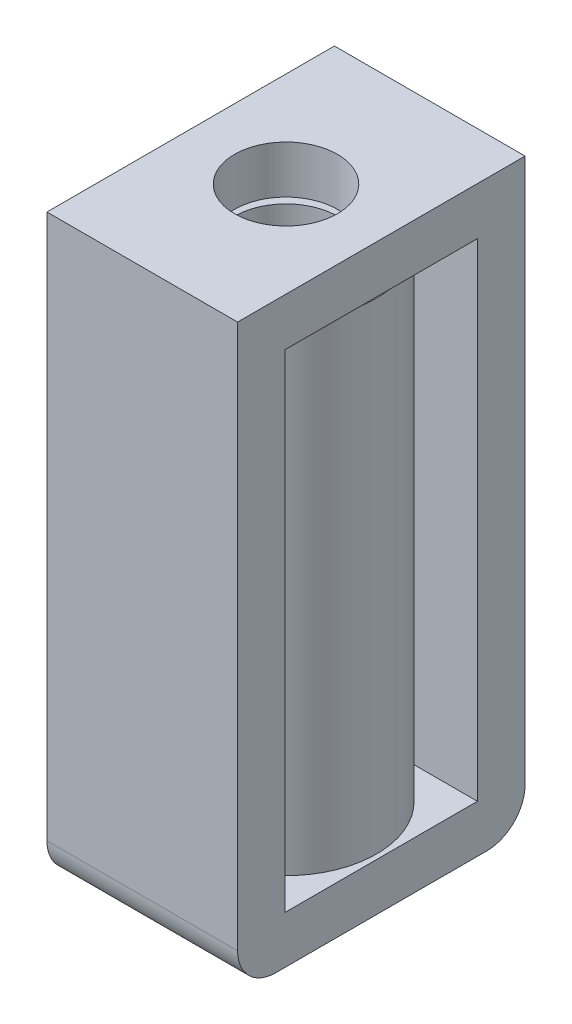
ISO-10303-21;
HEADER;
FILE_DESCRIPTION(('STEP AP214'),'2;1');
FILE_NAME('part.step','',(''),(''),'','','');
FILE_SCHEMA(('AUTOMOTIVE_DESIGN { 1 0 10303 214 1 1 1 1 }'));
ENDSEC;
DATA;
#1=APPLICATION_CONTEXT('core data for automotive mechanical design processes');
#2=APPLICATION_PROTOCOL_DEFINITION('international standard','automotive_design',2000,#1);
#3=PRODUCT_CONTEXT('',#1,'mechanical');
#4=PRODUCT('Part','Part','',(#3));
#5=PRODUCT_RELATED_PRODUCT_CATEGORY('part','',(#4));
#6=PRODUCT_DEFINITION_FORMATION('','',#4);
#7=PRODUCT_DEFINITION_CONTEXT('part definition',#1,'design');
#8=PRODUCT_DEFINITION('design','',#6,#7);
#9=PRODUCT_DEFINITION_SHAPE('','',#8);
#10=(LENGTH_UNIT() NAMED_UNIT(*) SI_UNIT(.MILLI.,.METRE.));
#11=(NAMED_UNIT(*) PLANE_ANGLE_UNIT() SI_UNIT($,.RADIAN.));
#12=(NAMED_UNIT(*) SI_UNIT($,.STERADIAN.) SOLID_ANGLE_UNIT());
#13=UNCERTAINTY_MEASURE_WITH_UNIT(LENGTH_MEASURE(1.E-05),#10,'distance_accuracy_value','');
#14=(GEOMETRIC_REPRESENTATION_CONTEXT(3) GLOBAL_UNCERTAINTY_ASSIGNED_CONTEXT((#13)) GLOBAL_UNIT_ASSIGNED_CONTEXT((#10,
#11,#12)) REPRESENTATION_CONTEXT('',''));
#15=CARTESIAN_POINT('',(0.,0.,0.));
#16=DIRECTION('',(0.,0.,1.));
#17=DIRECTION('',(1.,0.,0.));
#18=AXIS2_PLACEMENT_3D('',#15,#16,#17);
#19=CARTESIAN_POINT('',(-15.,2.5,5.04));
#20=DIRECTION('',(0.,-1.,0.));
#21=DIRECTION('',(0.,0.,-1.));
#22=AXIS2_PLACEMENT_3D('',#19,#20,#21);
#23=PLANE('',#22);
#24=DIRECTION('',(1.,0.,0.));
#25=VECTOR('',#24,1.);
#26=CARTESIAN_POINT('',(-15.,2.5,5.04));
#27=LINE('',#26,#25);
#28=CARTESIAN_POINT('',(-5.,2.5,5.04));
#29=VERTEX_POINT('',#28);
#30=CARTESIAN_POINT('',(5.,2.5,5.04));
#31=VERTEX_POINT('',#30);
#32=EDGE_CURVE('E123',#29,#31,#27,.T.);
#33=ORIENTED_EDGE('',*,*,#32,.T.);
#34=DIRECTION('',(0.,0.,-1.));
#35=VECTOR('',#34,1.);
#36=CARTESIAN_POINT('',(5.,2.5,5.04));
#37=LINE('',#36,#35);
#38=CARTESIAN_POINT('',(5.,2.5,-5.04));
#39=VERTEX_POINT('',#38);
#40=EDGE_CURVE('E138',#31,#39,#37,.T.);
#41=ORIENTED_EDGE('',*,*,#40,.T.);
#42=DIRECTION('',(1.,0.,0.));
#43=VECTOR('',#42,1.);
#44=CARTESIAN_POINT('',(-15.,2.5,-5.04));
#45=LINE('',#44,#43);
#46=CARTESIAN_POINT('',(-5.,2.5,-5.04));
#47=VERTEX_POINT('',#46);
#48=EDGE_CURVE('E143',#47,#39,#45,.T.);
#49=ORIENTED_EDGE('',*,*,#48,.F.);
#50=DIRECTION('',(0.,0.,-1.));
#51=VECTOR('',#50,1.);
#52=CARTESIAN_POINT('',(-5.,2.5,7.54));
#53=LINE('',#52,#51);
#54=EDGE_CURVE('E176',#29,#47,#53,.T.);
#55=ORIENTED_EDGE('',*,*,#54,.F.);
#56=EDGE_LOOP('',(#33,#41,#49,#55));
#57=FACE_BOUND('',#56,.T.);
#58=CARTESIAN_POINT('',(0.,2.5,0.));
#59=DIRECTION('',(0.,-1.,0.));
#60=DIRECTION('',(0.,0.,-1.));
#61=AXIS2_PLACEMENT_3D('',#58,#59,#60);
#62=CIRCLE('',#61,4.75);
#63=CARTESIAN_POINT('',(0.,2.5,-4.75));
#64=VERTEX_POINT('',#63);
#65=EDGE_CURVE('E182',#64,#64,#62,.F.);
#66=ORIENTED_EDGE('',*,*,#65,.F.);
#67=EDGE_LOOP('',(#66));
#68=FACE_BOUND('',#67,.T.);
#69=ADVANCED_FACE('F33',(#57,#68),#23,.F.);
#70=CARTESIAN_POINT('',(5.,30.56,7.54));
#71=DIRECTION('',(-1.,0.,0.));
#72=DIRECTION('',(0.,0.,1.));
#73=AXIS2_PLACEMENT_3D('',#70,#71,#72);
#74=PLANE('',#73);
#75=DIRECTION('',(0.,0.,1.));
#76=VECTOR('',#75,1.);
#77=CARTESIAN_POINT('',(5.,28.06,5.04));
#78=LINE('',#77,#76);
#79=CARTESIAN_POINT('',(5.,28.06,-5.04));
#80=VERTEX_POINT('',#79);
#81=CARTESIAN_POINT('',(5.,28.06,5.04));
#82=VERTEX_POINT('',#81);
#83=EDGE_CURVE('E128',#80,#82,#78,.T.);
#84=ORIENTED_EDGE('',*,*,#83,.F.);
#85=DIRECTION('',(0.,1.,0.));
#86=VECTOR('',#85,1.);
#87=CARTESIAN_POINT('',(5.,2.5,-5.04));
#88=LINE('',#87,#86);
#89=EDGE_CURVE('E133',#39,#80,#88,.T.);
#90=ORIENTED_EDGE('',*,*,#89,.F.);
#91=ORIENTED_EDGE('',*,*,#40,.F.);
#92=DIRECTION('',(0.,-1.,0.));
#93=VECTOR('',#92,1.);
#94=CARTESIAN_POINT('',(5.,2.5,5.04));
#95=LINE('',#94,#93);
#96=EDGE_CURVE('E117',#82,#31,#95,.T.);
#97=ORIENTED_EDGE('',*,*,#96,.F.);
#98=EDGE_LOOP('',(#84,#90,#91,#97));
#99=FACE_BOUND('',#98,.T.);
#100=DIRECTION('',(0.,0.,-1.));
#101=VECTOR('',#100,1.);
#102=CARTESIAN_POINT('',(5.,0.,7.54));
#103=LINE('',#102,#101);
#104=CARTESIAN_POINT('',(5.,0.,5.54));
#105=VERTEX_POINT('',#104);
#106=CARTESIAN_POINT('',(5.,0.,-5.54));
#107=VERTEX_POINT('',#106);
#108=EDGE_CURVE('E145',#105,#107,#103,.T.);
#109=ORIENTED_EDGE('',*,*,#108,.T.);
#110=CARTESIAN_POINT('',(5.,2.,-5.54));
#111=DIRECTION('',(-1.,0.,0.));
#112=DIRECTION('',(0.,0.,1.));
#113=AXIS2_PLACEMENT_3D('',#110,#111,#112);
#114=CIRCLE('',#113,2.);
#115=CARTESIAN_POINT('',(5.,2.00000000000001,-7.54));
#116=VERTEX_POINT('',#115);
#117=EDGE_CURVE('E41',#107,#116,#114,.F.);
#118=ORIENTED_EDGE('',*,*,#117,.T.);
#119=DIRECTION('',(0.,-1.,0.));
#120=VECTOR('',#119,1.);
#121=CARTESIAN_POINT('',(5.,30.56,-7.54));
#122=LINE('',#121,#120);
#123=CARTESIAN_POINT('',(5.,30.56,-7.54));
#124=VERTEX_POINT('',#123);
#125=EDGE_CURVE('E170',#124,#116,#122,.T.);
#126=ORIENTED_EDGE('',*,*,#125,.F.);
#127=DIRECTION('',(0.,0.,-1.));
#128=VECTOR('',#127,1.);
#129=CARTESIAN_POINT('',(5.,30.56,7.54));
#130=LINE('',#129,#128);
#131=CARTESIAN_POINT('',(5.,30.56,7.54));
#132=VERTEX_POINT('',#131);
#133=EDGE_CURVE('E148',#132,#124,#130,.T.);
#134=ORIENTED_EDGE('',*,*,#133,.F.);
#135=DIRECTION('',(0.,-1.,0.));
#136=VECTOR('',#135,1.);
#137=CARTESIAN_POINT('',(5.,30.56,7.54));
#138=LINE('',#137,#136);
#139=CARTESIAN_POINT('',(5.,2.00000000000001,7.54));
#140=VERTEX_POINT('',#139);
#141=EDGE_CURVE('E158',#132,#140,#138,.T.);
#142=ORIENTED_EDGE('',*,*,#141,.T.);
#143=CARTESIAN_POINT('',(5.,2.,5.54));
#144=DIRECTION('',(-1.,0.,0.));
#145=DIRECTION('',(0.,0.,1.));
#146=AXIS2_PLACEMENT_3D('',#143,#144,#145);
#147=CIRCLE('',#146,2.);
#148=EDGE_CURVE('E48',#140,#105,#147,.F.);
#149=ORIENTED_EDGE('',*,*,#148,.T.);
#150=EDGE_LOOP('',(#109,#118,#126,#134,#142,#149));
#151=FACE_BOUND('',#150,.T.);
#152=ADVANCED_FACE('F135',(#99,#151),#74,.F.);
#153=CARTESIAN_POINT('',(-5.,30.56,-7.54));
#154=DIRECTION('',(0.,0.,1.));
#155=DIRECTION('',(1.,0.,0.));
#156=AXIS2_PLACEMENT_3D('',#153,#154,#155);
#157=PLANE('',#156);
#158=CARTESIAN_POINT('',(0.,5.2,-7.54));
#159=DIRECTION('',(0.,0.,-1.));
#160=DIRECTION('',(-1.,0.,0.));
#161=AXIS2_PLACEMENT_3D('',#158,#159,#160);
#162=CIRCLE('',#161,0.799999999999999);
#163=CARTESIAN_POINT('',(-0.799999999999999,5.2,-7.54));
#164=VERTEX_POINT('',#163);
#165=EDGE_CURVE('E278',#164,#164,#162,.T.);
#166=ORIENTED_EDGE('',*,*,#165,.F.);
#167=EDGE_LOOP('',(#166));
#168=FACE_BOUND('',#167,.T.);
#169=CARTESIAN_POINT('',(0.,22.26,-7.54));
#170=DIRECTION('',(0.,0.,-1.));
#171=DIRECTION('',(-1.,0.,0.));
#172=AXIS2_PLACEMENT_3D('',#169,#170,#171);
#173=CIRCLE('',#172,0.799999999999999);
#174=CARTESIAN_POINT('',(-0.799999999999999,22.26,-7.54));
#175=VERTEX_POINT('',#174);
#176=EDGE_CURVE('E274',#175,#175,#173,.T.);
#177=ORIENTED_EDGE('',*,*,#176,.F.);
#178=EDGE_LOOP('',(#177));
#179=FACE_BOUND('',#178,.T.);
#180=ORIENTED_EDGE('',*,*,#125,.T.);
#181=DIRECTION('',(-1.,0.,0.));
#182=VECTOR('',#181,1.);
#183=CARTESIAN_POINT('',(-5.,2.,-7.54));
#184=LINE('',#183,#182);
#185=CARTESIAN_POINT('',(-5.,2.00000000000001,-7.54));
#186=VERTEX_POINT('',#185);
#187=EDGE_CURVE('E185',#116,#186,#184,.T.);
#188=ORIENTED_EDGE('',*,*,#187,.T.);
#189=DIRECTION('',(0.,-1.,0.));
#190=VECTOR('',#189,1.);
#191=CARTESIAN_POINT('',(-5.,30.56,-7.54));
#192=LINE('',#191,#190);
#193=CARTESIAN_POINT('',(-5.,30.56,-7.54));
#194=VERTEX_POINT('',#193);
#195=EDGE_CURVE('E167',#194,#186,#192,.T.);
#196=ORIENTED_EDGE('',*,*,#195,.F.);
#197=DIRECTION('',(-1.,0.,0.));
#198=VECTOR('',#197,1.);
#199=CARTESIAN_POINT('',(-5.,30.56,-7.54));
#200=LINE('',#199,#198);
#201=EDGE_CURVE('E151',#124,#194,#200,.T.);
#202=ORIENTED_EDGE('',*,*,#201,.F.);
#203=EDGE_LOOP('',(#180,#188,#196,#202));
#204=FACE_BOUND('',#203,.T.);
#205=ADVANCED_FACE('F206',(#168,#179,#204),#157,.F.);
#206=CARTESIAN_POINT('',(-5.,30.56,7.54));
#207=DIRECTION('',(1.,0.,0.));
#208=DIRECTION('',(0.,0.,-1.));
#209=AXIS2_PLACEMENT_3D('',#206,#207,#208);
#210=PLANE('',#209);
#211=ORIENTED_EDGE('',*,*,#54,.T.);
#212=DIRECTION('',(0.,1.,0.));
#213=VECTOR('',#212,1.);
#214=CARTESIAN_POINT('',(-5.,30.56,-5.04));
#215=LINE('',#214,#213);
#216=CARTESIAN_POINT('',(-5.,28.06,-5.04));
#217=VERTEX_POINT('',#216);
#218=EDGE_CURVE('E179',#47,#217,#215,.T.);
#219=ORIENTED_EDGE('',*,*,#218,.T.);
#220=DIRECTION('',(0.,0.,1.));
#221=VECTOR('',#220,1.);
#222=CARTESIAN_POINT('',(-5.,28.06,7.54));
#223=LINE('',#222,#221);
#224=CARTESIAN_POINT('',(-5.,28.06,5.04));
#225=VERTEX_POINT('',#224);
#226=EDGE_CURVE('E173',#217,#225,#223,.T.);
#227=ORIENTED_EDGE('',*,*,#226,.T.);
#228=DIRECTION('',(0.,-1.,0.));
#229=VECTOR('',#228,1.);
#230=CARTESIAN_POINT('',(-5.,30.56,5.04));
#231=LINE('',#230,#229);
#232=EDGE_CURVE('E120',#225,#29,#231,.T.);
#233=ORIENTED_EDGE('',*,*,#232,.T.);
#234=EDGE_LOOP('',(#211,#219,#227,#233));
#235=FACE_BOUND('',#234,.T.);
#236=ORIENTED_EDGE('',*,*,#195,.T.);
#237=CARTESIAN_POINT('',(-5.,2.,-5.54));
#238=DIRECTION('',(1.,0.,0.));
#239=DIRECTION('',(0.,0.,-1.));
#240=AXIS2_PLACEMENT_3D('',#237,#238,#239);
#241=CIRCLE('',#240,2.);
#242=CARTESIAN_POINT('',(-5.,0.,-5.54));
#243=VERTEX_POINT('',#242);
#244=EDGE_CURVE('E195',#186,#243,#241,.F.);
#245=ORIENTED_EDGE('',*,*,#244,.T.);
#246=DIRECTION('',(0.,0.,1.));
#247=VECTOR('',#246,1.);
#248=CARTESIAN_POINT('',(-5.,0.,7.54));
#249=LINE('',#248,#247);
#250=CARTESIAN_POINT('',(-5.,0.,5.54));
#251=VERTEX_POINT('',#250);
#252=EDGE_CURVE('E152',#243,#251,#249,.T.);
#253=ORIENTED_EDGE('',*,*,#252,.T.);
#254=CARTESIAN_POINT('',(-5.,2.,5.54));
#255=DIRECTION('',(1.,0.,0.));
#256=DIRECTION('',(0.,0.,-1.));
#257=AXIS2_PLACEMENT_3D('',#254,#255,#256);
#258=CIRCLE('',#257,2.);
#259=CARTESIAN_POINT('',(-5.,2.00000000000001,7.54));
#260=VERTEX_POINT('',#259);
#261=EDGE_CURVE('E193',#251,#260,#258,.F.);
#262=ORIENTED_EDGE('',*,*,#261,.T.);
#263=DIRECTION('',(0.,-1.,0.));
#264=VECTOR('',#263,1.);
#265=CARTESIAN_POINT('',(-5.,30.56,7.54));
#266=LINE('',#265,#264);
#267=CARTESIAN_POINT('',(-5.,30.56,7.54));
#268=VERTEX_POINT('',#267);
#269=EDGE_CURVE('E164',#268,#260,#266,.T.);
#270=ORIENTED_EDGE('',*,*,#269,.F.);
#271=DIRECTION('',(0.,0.,1.));
#272=VECTOR('',#271,1.);
#273=CARTESIAN_POINT('',(-5.,30.56,7.54));
#274=LINE('',#273,#272);
#275=EDGE_CURVE('E154',#194,#268,#274,.T.);
#276=ORIENTED_EDGE('',*,*,#275,.F.);
#277=EDGE_LOOP('',(#236,#245,#253,#262,#270,#276));
#278=FACE_BOUND('',#277,.T.);
#279=ADVANCED_FACE('F210',(#235,#278),#210,.F.);
#280=CARTESIAN_POINT('',(-5.,30.56,7.54));
#281=DIRECTION('',(0.,0.,-1.));
#282=DIRECTION('',(-1.,0.,0.));
#283=AXIS2_PLACEMENT_3D('',#280,#281,#282);
#284=PLANE('',#283);
#285=ORIENTED_EDGE('',*,*,#269,.T.);
#286=DIRECTION('',(1.,0.,0.));
#287=VECTOR('',#286,1.);
#288=CARTESIAN_POINT('',(5.,2.,7.54));
#289=LINE('',#288,#287);
#290=EDGE_CURVE('E11',#260,#140,#289,.T.);
#291=ORIENTED_EDGE('',*,*,#290,.T.);
#292=ORIENTED_EDGE('',*,*,#141,.F.);
#293=DIRECTION('',(1.,0.,0.));
#294=VECTOR('',#293,1.);
#295=CARTESIAN_POINT('',(-5.,30.56,7.54));
#296=LINE('',#295,#294);
#297=EDGE_CURVE('E156',#268,#132,#296,.T.);
#298=ORIENTED_EDGE('',*,*,#297,.F.);
#299=EDGE_LOOP('',(#285,#291,#292,#298));
#300=FACE_BOUND('',#299,.T.);
#301=ADVANCED_FACE('F217',(#300),#284,.F.);
#302=CARTESIAN_POINT('',(0.,30.56,0.));
#303=DIRECTION('',(0.,-1.,0.));
#304=DIRECTION('',(0.,0.,-1.));
#305=AXIS2_PLACEMENT_3D('',#302,#303,#304);
#306=PLANE('',#305);
#307=CARTESIAN_POINT('',(0.,30.56,0.));
#308=DIRECTION('',(0.,1.,0.));
#309=DIRECTION('',(0.,0.,1.));
#310=AXIS2_PLACEMENT_3D('',#307,#308,#309);
#311=CIRCLE('',#310,2.7);
#312=CARTESIAN_POINT('',(0.,30.56,2.7));
#313=VERTEX_POINT('',#312);
#314=EDGE_CURVE('E268',#313,#313,#311,.T.);
#315=ORIENTED_EDGE('',*,*,#314,.F.);
#316=EDGE_LOOP('',(#315));
#317=FACE_BOUND('',#316,.T.);
#318=ORIENTED_EDGE('',*,*,#133,.T.);
#319=ORIENTED_EDGE('',*,*,#201,.T.);
#320=ORIENTED_EDGE('',*,*,#275,.T.);
#321=ORIENTED_EDGE('',*,*,#297,.T.);
#322=EDGE_LOOP('',(#318,#319,#320,#321));
#323=FACE_BOUND('',#322,.T.);
#324=ADVANCED_FACE('F220',(#317,#323),#306,.F.);
#325=CARTESIAN_POINT('',(0.,0.,0.));
#326=DIRECTION('',(0.,-1.,0.));
#327=DIRECTION('',(0.,0.,-1.));
#328=AXIS2_PLACEMENT_3D('',#325,#326,#327);
#329=PLANE('',#328);
#330=ORIENTED_EDGE('',*,*,#252,.F.);
#331=DIRECTION('',(-1.,0.,0.));
#332=VECTOR('',#331,1.);
#333=CARTESIAN_POINT('',(5.,0.,-5.54));
#334=LINE('',#333,#332);
#335=EDGE_CURVE('E55',#243,#107,#334,.F.);
#336=ORIENTED_EDGE('',*,*,#335,.T.);
#337=ORIENTED_EDGE('',*,*,#108,.F.);
#338=DIRECTION('',(1.,0.,0.));
#339=VECTOR('',#338,1.);
#340=CARTESIAN_POINT('',(-5.,0.,5.54));
#341=LINE('',#340,#339);
#342=EDGE_CURVE('E197',#105,#251,#341,.F.);
#343=ORIENTED_EDGE('',*,*,#342,.T.);
#344=EDGE_LOOP('',(#330,#336,#337,#343));
#345=FACE_BOUND('',#344,.T.);
#346=ADVANCED_FACE('F213',(#345),#329,.T.);
#347=CARTESIAN_POINT('',(-15.,2.5,-5.04));
#348=DIRECTION('',(0.,0.,-1.));
#349=DIRECTION('',(-1.,0.,0.));
#350=AXIS2_PLACEMENT_3D('',#347,#348,#349);
#351=PLANE('',#350);
#352=CARTESIAN_POINT('',(0.,5.2,-5.04));
#353=DIRECTION('',(0.,0.,-1.));
#354=DIRECTION('',(-1.,0.,0.));
#355=AXIS2_PLACEMENT_3D('',#352,#353,#354);
#356=CIRCLE('',#355,0.799999999999999);
#357=CARTESIAN_POINT('',(-0.799999999999999,5.2,-5.04));
#358=VERTEX_POINT('',#357);
#359=EDGE_CURVE('E256',#358,#358,#356,.F.);
#360=ORIENTED_EDGE('',*,*,#359,.F.);
#361=EDGE_LOOP('',(#360));
#362=FACE_BOUND('',#361,.T.);
#363=CARTESIAN_POINT('',(0.,22.26,-5.04));
#364=DIRECTION('',(0.,0.,-1.));
#365=DIRECTION('',(-1.,0.,0.));
#366=AXIS2_PLACEMENT_3D('',#363,#364,#365);
#367=CIRCLE('',#366,0.799999999999999);
#368=CARTESIAN_POINT('',(-0.799999999999999,22.26,-5.04));
#369=VERTEX_POINT('',#368);
#370=EDGE_CURVE('E260',#369,#369,#367,.F.);
#371=ORIENTED_EDGE('',*,*,#370,.F.);
#372=EDGE_LOOP('',(#371));
#373=FACE_BOUND('',#372,.T.);
#374=ORIENTED_EDGE('',*,*,#48,.T.);
#375=ORIENTED_EDGE('',*,*,#89,.T.);
#376=DIRECTION('',(1.,0.,0.));
#377=VECTOR('',#376,1.);
#378=CARTESIAN_POINT('',(-15.,28.06,-5.04));
#379=LINE('',#378,#377);
#380=EDGE_CURVE('E124',#217,#80,#379,.T.);
#381=ORIENTED_EDGE('',*,*,#380,.F.);
#382=ORIENTED_EDGE('',*,*,#218,.F.);
#383=EDGE_LOOP('',(#374,#375,#381,#382));
#384=FACE_BOUND('',#383,.T.);
#385=ADVANCED_FACE('F228',(#362,#373,#384),#351,.F.);
#386=CARTESIAN_POINT('',(-15.,2.5,5.04));
#387=DIRECTION('',(0.,0.,1.));
#388=DIRECTION('',(1.,0.,0.));
#389=AXIS2_PLACEMENT_3D('',#386,#387,#388);
#390=PLANE('',#389);
#391=DIRECTION('',(1.,0.,0.));
#392=VECTOR('',#391,1.);
#393=CARTESIAN_POINT('',(-15.,28.06,5.04));
#394=LINE('',#393,#392);
#395=EDGE_CURVE('E112',#225,#82,#394,.T.);
#396=ORIENTED_EDGE('',*,*,#395,.T.);
#397=ORIENTED_EDGE('',*,*,#96,.T.);
#398=ORIENTED_EDGE('',*,*,#32,.F.);
#399=ORIENTED_EDGE('',*,*,#232,.F.);
#400=EDGE_LOOP('',(#396,#397,#398,#399));
#401=FACE_BOUND('',#400,.T.);
#402=ADVANCED_FACE('F114',(#401),#390,.F.);
#403=CARTESIAN_POINT('',(-15.,28.06,5.04));
#404=DIRECTION('',(0.,1.,0.));
#405=DIRECTION('',(0.,0.,1.));
#406=AXIS2_PLACEMENT_3D('',#403,#404,#405);
#407=PLANE('',#406);
#408=CARTESIAN_POINT('',(0.,28.06,0.));
#409=DIRECTION('',(0.,1.,0.));
#410=DIRECTION('',(0.,0.,1.));
#411=AXIS2_PLACEMENT_3D('',#408,#409,#410);
#412=CIRCLE('',#411,2.7);
#413=CARTESIAN_POINT('',(0.,28.06,2.7));
#414=VERTEX_POINT('',#413);
#415=EDGE_CURVE('E189',#414,#414,#412,.T.);
#416=ORIENTED_EDGE('',*,*,#415,.T.);
#417=EDGE_LOOP('',(#416));
#418=FACE_BOUND('',#417,.T.);
#419=ORIENTED_EDGE('',*,*,#380,.T.);
#420=ORIENTED_EDGE('',*,*,#83,.T.);
#421=ORIENTED_EDGE('',*,*,#395,.F.);
#422=ORIENTED_EDGE('',*,*,#226,.F.);
#423=EDGE_LOOP('',(#419,#420,#421,#422));
#424=FACE_BOUND('',#423,.T.);
#425=ADVANCED_FACE('F129',(#418,#424),#407,.F.);
#426=CARTESIAN_POINT('',(0.,27.75,0.));
#427=DIRECTION('',(0.,-1.,0.));
#428=DIRECTION('',(0.,0.,-1.));
#429=AXIS2_PLACEMENT_3D('',#426,#427,#428);
#430=CYLINDRICAL_SURFACE('',#429,4.75);
#431=CARTESIAN_POINT('',(0.,27.75,0.));
#432=DIRECTION('',(0.,1.,0.));
#433=DIRECTION('',(0.,0.,1.));
#434=AXIS2_PLACEMENT_3D('',#431,#432,#433);
#435=CIRCLE('',#434,4.75);
#436=CARTESIAN_POINT('',(0.,27.75,4.75));
#437=VERTEX_POINT('',#436);
#438=EDGE_CURVE('E262',#437,#437,#435,.T.);
#439=ORIENTED_EDGE('',*,*,#438,.F.);
#440=EDGE_LOOP('',(#439));
#441=FACE_BOUND('',#440,.T.);
#442=ORIENTED_EDGE('',*,*,#65,.T.);
#443=EDGE_LOOP('',(#442));
#444=FACE_BOUND('',#443,.T.);
#445=ADVANCED_FACE('F243',(#441,#444),#430,.T.);
#446=CARTESIAN_POINT('',(0.,27.75,0.));
#447=DIRECTION('',(0.,1.,0.));
#448=DIRECTION('',(0.,0.,1.));
#449=AXIS2_PLACEMENT_3D('',#446,#447,#448);
#450=PLANE('',#449);
#451=CARTESIAN_POINT('',(0.,27.75,0.));
#452=DIRECTION('',(0.,1.,0.));
#453=DIRECTION('',(0.,0.,1.));
#454=AXIS2_PLACEMENT_3D('',#451,#452,#453);
#455=CIRCLE('',#454,2.7);
#456=CARTESIAN_POINT('',(0.,27.75,2.7));
#457=VERTEX_POINT('',#456);
#458=EDGE_CURVE('E186',#457,#457,#455,.T.);
#459=ORIENTED_EDGE('',*,*,#458,.F.);
#460=EDGE_LOOP('',(#459));
#461=FACE_BOUND('',#460,.T.);
#462=ORIENTED_EDGE('',*,*,#438,.T.);
#463=EDGE_LOOP('',(#462));
#464=FACE_BOUND('',#463,.T.);
#465=ADVANCED_FACE('F304',(#461,#464),#450,.T.);
#466=CARTESIAN_POINT('',(0.,10.56,0.));
#467=DIRECTION('',(0.,1.,0.));
#468=DIRECTION('',(0.,0.,1.));
#469=AXIS2_PLACEMENT_3D('',#466,#467,#468);
#470=PLANE('',#469);
#471=CARTESIAN_POINT('',(0.,10.56,0.));
#472=DIRECTION('',(0.,1.,0.));
#473=DIRECTION('',(0.,0.,1.));
#474=AXIS2_PLACEMENT_3D('',#471,#472,#473);
#475=CIRCLE('',#474,2.7);
#476=CARTESIAN_POINT('',(0.,10.56,2.7));
#477=VERTEX_POINT('',#476);
#478=EDGE_CURVE('E190',#477,#477,#475,.T.);
#479=ORIENTED_EDGE('',*,*,#478,.T.);
#480=EDGE_LOOP('',(#479));
#481=FACE_BOUND('',#480,.T.);
#482=ADVANCED_FACE('F300',(#481),#470,.T.);
#483=CARTESIAN_POINT('',(0.,10.56,0.));
#484=DIRECTION('',(0.,1.,0.));
#485=DIRECTION('',(0.,0.,1.));
#486=AXIS2_PLACEMENT_3D('',#483,#484,#485);
#487=CYLINDRICAL_SURFACE('',#486,2.7);
#488=ORIENTED_EDGE('',*,*,#458,.T.);
#489=EDGE_LOOP('',(#488));
#490=FACE_BOUND('',#489,.T.);
#491=ORIENTED_EDGE('',*,*,#478,.F.);
#492=EDGE_LOOP('',(#491));
#493=FACE_BOUND('',#492,.T.);
#494=ADVANCED_FACE('F303',(#490,#493),#487,.F.);
#495=ORIENTED_EDGE('',*,*,#314,.T.);
#496=EDGE_LOOP('',(#495));
#497=FACE_BOUND('',#496,.T.);
#498=ORIENTED_EDGE('',*,*,#415,.F.);
#499=EDGE_LOOP('',(#498));
#500=FACE_BOUND('',#499,.T.);
#501=ADVANCED_FACE('F307',(#497,#500),#487,.F.);
#502=CARTESIAN_POINT('',(-5.,2.,-5.54));
#503=DIRECTION('',(1.,0.,0.));
#504=DIRECTION('',(0.,0.,-1.));
#505=AXIS2_PLACEMENT_3D('',#502,#503,#504);
#506=CYLINDRICAL_SURFACE('',#505,2.);
#507=ORIENTED_EDGE('',*,*,#117,.F.);
#508=ORIENTED_EDGE('',*,*,#335,.F.);
#509=ORIENTED_EDGE('',*,*,#244,.F.);
#510=ORIENTED_EDGE('',*,*,#187,.F.);
#511=EDGE_LOOP('',(#507,#508,#509,#510));
#512=FACE_BOUND('',#511,.T.);
#513=ADVANCED_FACE('F208',(#512),#506,.T.);
#514=CARTESIAN_POINT('',(-5.,2.,5.54));
#515=DIRECTION('',(-1.,0.,0.));
#516=DIRECTION('',(0.,0.,1.));
#517=AXIS2_PLACEMENT_3D('',#514,#515,#516);
#518=CYLINDRICAL_SURFACE('',#517,2.);
#519=ORIENTED_EDGE('',*,*,#261,.F.);
#520=ORIENTED_EDGE('',*,*,#342,.F.);
#521=ORIENTED_EDGE('',*,*,#148,.F.);
#522=ORIENTED_EDGE('',*,*,#290,.F.);
#523=EDGE_LOOP('',(#519,#520,#521,#522));
#524=FACE_BOUND('',#523,.T.);
#525=ADVANCED_FACE('F35',(#524),#518,.T.);
#526=CARTESIAN_POINT('',(0.,22.26,7.541));
#527=DIRECTION('',(0.,0.,-1.));
#528=DIRECTION('',(-1.,0.,0.));
#529=AXIS2_PLACEMENT_3D('',#526,#527,#528);
#530=CYLINDRICAL_SURFACE('',#529,0.799999999999999);
#531=ORIENTED_EDGE('',*,*,#176,.T.);
#532=EDGE_LOOP('',(#531));
#533=FACE_BOUND('',#532,.T.);
#534=ORIENTED_EDGE('',*,*,#370,.T.);
#535=EDGE_LOOP('',(#534));
#536=FACE_BOUND('',#535,.T.);
#537=ADVANCED_FACE('F290',(#533,#536),#530,.F.);
#538=CARTESIAN_POINT('',(0.,5.2,7.541));
#539=DIRECTION('',(0.,0.,-1.));
#540=DIRECTION('',(-1.,0.,0.));
#541=AXIS2_PLACEMENT_3D('',#538,#539,#540);
#542=CYLINDRICAL_SURFACE('',#541,0.799999999999999);
#543=ORIENTED_EDGE('',*,*,#165,.T.);
#544=EDGE_LOOP('',(#543));
#545=FACE_BOUND('',#544,.T.);
#546=ORIENTED_EDGE('',*,*,#359,.T.);
#547=EDGE_LOOP('',(#546));
#548=FACE_BOUND('',#547,.T.);
#549=ADVANCED_FACE('F282',(#545,#548),#542,.F.);
#550=CLOSED_SHELL('',(#69,#152,#205,#279,#301,#324,#346,#385,#402,#425,#445,#465,#482,#494,#501,
#513,#525,#537,#549));
#551=MANIFOLD_SOLID_BREP('B2',#550);
#552=ADVANCED_BREP_SHAPE_REPRESENTATION('',(#18,#551),#14);
#553=SHAPE_DEFINITION_REPRESENTATION(#9,#552);
ENDSEC;
END-ISO-10303-21;
